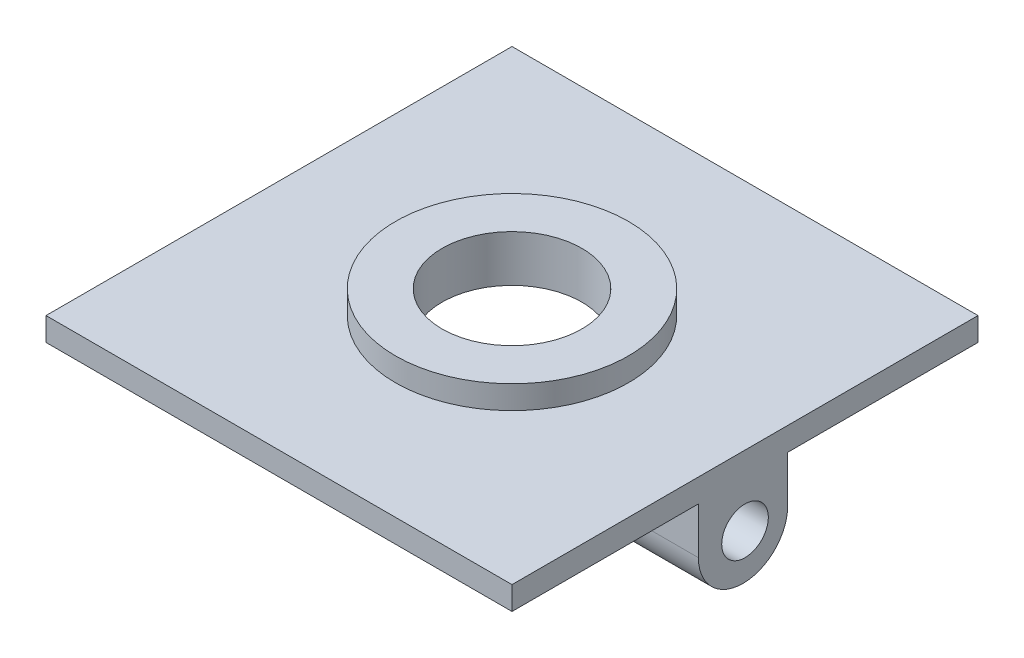
ISO-10303-21;
HEADER;
FILE_DESCRIPTION(('STEP AP214'),'2;1');
FILE_NAME('part.step','',(''),(''),'','','');
FILE_SCHEMA(('AUTOMOTIVE_DESIGN { 1 0 10303 214 1 1 1 1 }'));
ENDSEC;
DATA;
#1=APPLICATION_CONTEXT('core data for automotive mechanical design processes');
#2=APPLICATION_PROTOCOL_DEFINITION('international standard','automotive_design',2000,#1);
#3=PRODUCT_CONTEXT('',#1,'mechanical');
#4=PRODUCT('Part','Part','',(#3));
#5=PRODUCT_RELATED_PRODUCT_CATEGORY('part','',(#4));
#6=PRODUCT_DEFINITION_FORMATION('','',#4);
#7=PRODUCT_DEFINITION_CONTEXT('part definition',#1,'design');
#8=PRODUCT_DEFINITION('design','',#6,#7);
#9=PRODUCT_DEFINITION_SHAPE('','',#8);
#10=(LENGTH_UNIT() NAMED_UNIT(*) SI_UNIT(.MILLI.,.METRE.));
#11=(NAMED_UNIT(*) PLANE_ANGLE_UNIT() SI_UNIT($,.RADIAN.));
#12=(NAMED_UNIT(*) SI_UNIT($,.STERADIAN.) SOLID_ANGLE_UNIT());
#13=UNCERTAINTY_MEASURE_WITH_UNIT(LENGTH_MEASURE(1.E-05),#10,'distance_accuracy_value','');
#14=(GEOMETRIC_REPRESENTATION_CONTEXT(3) GLOBAL_UNCERTAINTY_ASSIGNED_CONTEXT((#13)) GLOBAL_UNIT_ASSIGNED_CONTEXT((#10,
#11,#12)) REPRESENTATION_CONTEXT('',''));
#15=CARTESIAN_POINT('',(0.,0.,0.));
#16=DIRECTION('',(0.,0.,1.));
#17=DIRECTION('',(1.,0.,0.));
#18=AXIS2_PLACEMENT_3D('',#15,#16,#17);
#19=CARTESIAN_POINT('',(0.,0.,0.));
#20=DIRECTION('',(0.,1.,0.));
#21=DIRECTION('',(0.,0.,1.));
#22=AXIS2_PLACEMENT_3D('',#19,#20,#21);
#23=PLANE('',#22);
#24=CARTESIAN_POINT('',(50.,0.,50.));
#25=DIRECTION('',(0.,1.,0.));
#26=DIRECTION('',(0.,0.,1.));
#27=AXIS2_PLACEMENT_3D('',#24,#25,#26);
#28=CIRCLE('',#27,15.);
#29=CARTESIAN_POINT('',(50.,0.,65.));
#30=VERTEX_POINT('',#29);
#31=EDGE_CURVE('E205',#30,#30,#28,.T.);
#32=ORIENTED_EDGE('',*,*,#31,.T.);
#33=EDGE_LOOP('',(#32));
#34=FACE_BOUND('',#33,.T.);
#35=DIRECTION('',(0.,0.,-1.));
#36=VECTOR('',#35,1.);
#37=CARTESIAN_POINT('',(20.,0.,40.));
#38=LINE('',#37,#36);
#39=CARTESIAN_POINT('',(20.,0.,60.));
#40=VERTEX_POINT('',#39);
#41=CARTESIAN_POINT('',(20.,0.,40.));
#42=VERTEX_POINT('',#41);
#43=EDGE_CURVE('E149',#40,#42,#38,.T.);
#44=ORIENTED_EDGE('',*,*,#43,.T.);
#45=DIRECTION('',(-1.,0.,0.));
#46=VECTOR('',#45,1.);
#47=CARTESIAN_POINT('',(20.,0.,40.));
#48=LINE('',#47,#46);
#49=CARTESIAN_POINT('',(0.,0.,40.));
#50=VERTEX_POINT('',#49);
#51=EDGE_CURVE('E162',#42,#50,#48,.T.);
#52=ORIENTED_EDGE('',*,*,#51,.T.);
#53=DIRECTION('',(0.,0.,1.));
#54=VECTOR('',#53,1.);
#55=CARTESIAN_POINT('',(0.,0.,0.));
#56=LINE('',#55,#54);
#57=CARTESIAN_POINT('',(0.,0.,0.));
#58=VERTEX_POINT('',#57);
#59=EDGE_CURVE('E225',#58,#50,#56,.T.);
#60=ORIENTED_EDGE('',*,*,#59,.F.);
#61=DIRECTION('',(-1.,0.,0.));
#62=VECTOR('',#61,1.);
#63=CARTESIAN_POINT('',(0.,0.,0.));
#64=LINE('',#63,#62);
#65=CARTESIAN_POINT('',(100.,0.,0.));
#66=VERTEX_POINT('',#65);
#67=EDGE_CURVE('E218',#66,#58,#64,.T.);
#68=ORIENTED_EDGE('',*,*,#67,.F.);
#69=DIRECTION('',(0.,0.,-1.));
#70=VECTOR('',#69,1.);
#71=CARTESIAN_POINT('',(100.,0.,0.));
#72=LINE('',#71,#70);
#73=CARTESIAN_POINT('',(100.,0.,40.8515105993032));
#74=VERTEX_POINT('',#73);
#75=EDGE_CURVE('E230',#74,#66,#72,.T.);
#76=ORIENTED_EDGE('',*,*,#75,.F.);
#77=DIRECTION('',(1.,0.,0.));
#78=VECTOR('',#77,1.);
#79=CARTESIAN_POINT('',(80.,0.,40.8515105993032));
#80=LINE('',#79,#78);
#81=CARTESIAN_POINT('',(80.,0.,40.8515105993032));
#82=VERTEX_POINT('',#81);
#83=EDGE_CURVE('E200',#82,#74,#80,.T.);
#84=ORIENTED_EDGE('',*,*,#83,.F.);
#85=DIRECTION('',(0.,0.,1.));
#86=VECTOR('',#85,1.);
#87=CARTESIAN_POINT('',(80.,0.,60.));
#88=LINE('',#87,#86);
#89=CARTESIAN_POINT('',(80.,0.,60.));
#90=VERTEX_POINT('',#89);
#91=EDGE_CURVE('E187',#82,#90,#88,.T.);
#92=ORIENTED_EDGE('',*,*,#91,.T.);
#93=DIRECTION('',(1.,0.,0.));
#94=VECTOR('',#93,1.);
#95=CARTESIAN_POINT('',(80.,0.,60.));
#96=LINE('',#95,#94);
#97=CARTESIAN_POINT('',(100.,0.,60.));
#98=VERTEX_POINT('',#97);
#99=EDGE_CURVE('E197',#90,#98,#96,.T.);
#100=ORIENTED_EDGE('',*,*,#99,.T.);
#101=CARTESIAN_POINT('',(100.,0.,100.));
#102=VERTEX_POINT('',#101);
#103=EDGE_CURVE('E231',#102,#98,#72,.T.);
#104=ORIENTED_EDGE('',*,*,#103,.F.);
#105=DIRECTION('',(1.,0.,0.));
#106=VECTOR('',#105,1.);
#107=CARTESIAN_POINT('',(0.,0.,100.));
#108=LINE('',#107,#106);
#109=CARTESIAN_POINT('',(0.,0.,100.));
#110=VERTEX_POINT('',#109);
#111=EDGE_CURVE('E228',#110,#102,#108,.T.);
#112=ORIENTED_EDGE('',*,*,#111,.F.);
#113=CARTESIAN_POINT('',(0.,0.,60.));
#114=VERTEX_POINT('',#113);
#115=EDGE_CURVE('E212',#114,#110,#56,.T.);
#116=ORIENTED_EDGE('',*,*,#115,.F.);
#117=DIRECTION('',(-1.,0.,0.));
#118=VECTOR('',#117,1.);
#119=CARTESIAN_POINT('',(20.,0.,60.));
#120=LINE('',#119,#118);
#121=EDGE_CURVE('E175',#40,#114,#120,.T.);
#122=ORIENTED_EDGE('',*,*,#121,.F.);
#123=EDGE_LOOP('',(#44,#52,#60,#68,#76,#84,#92,#100,#104,#112,#116,#122));
#124=FACE_BOUND('',#123,.T.);
#125=ADVANCED_FACE('F48',(#34,#124),#23,.F.);
#126=CARTESIAN_POINT('',(0.,5.,0.));
#127=DIRECTION('',(1.,0.,0.));
#128=DIRECTION('',(0.,0.,-1.));
#129=AXIS2_PLACEMENT_3D('',#126,#127,#128);
#130=PLANE('',#129);
#131=CARTESIAN_POINT('',(0.,-10.,50.));
#132=DIRECTION('',(-1.,0.,0.));
#133=DIRECTION('',(0.,0.,1.));
#134=AXIS2_PLACEMENT_3D('',#131,#132,#133);
#135=CIRCLE('',#134,5.);
#136=CARTESIAN_POINT('',(0.,-10.,55.));
#137=VERTEX_POINT('',#136);
#138=EDGE_CURVE('E453',#137,#137,#135,.T.);
#139=ORIENTED_EDGE('',*,*,#138,.F.);
#140=EDGE_LOOP('',(#139));
#141=FACE_BOUND('',#140,.T.);
#142=ORIENTED_EDGE('',*,*,#59,.T.);
#143=DIRECTION('',(0.,-1.,0.));
#144=VECTOR('',#143,1.);
#145=CARTESIAN_POINT('',(0.,0.,40.));
#146=LINE('',#145,#144);
#147=CARTESIAN_POINT('',(0.,-10.,40.));
#148=VERTEX_POINT('',#147);
#149=EDGE_CURVE('E171',#50,#148,#146,.T.);
#150=ORIENTED_EDGE('',*,*,#149,.T.);
#151=CARTESIAN_POINT('',(0.,-10.,50.));
#152=DIRECTION('',(-1.,0.,0.));
#153=DIRECTION('',(0.,0.,1.));
#154=AXIS2_PLACEMENT_3D('',#151,#152,#153);
#155=CIRCLE('',#154,10.);
#156=CARTESIAN_POINT('',(0.,-10.,60.));
#157=VERTEX_POINT('',#156);
#158=EDGE_CURVE('E144',#148,#157,#155,.T.);
#159=ORIENTED_EDGE('',*,*,#158,.T.);
#160=DIRECTION('',(0.,1.,0.));
#161=VECTOR('',#160,1.);
#162=CARTESIAN_POINT('',(0.,0.,60.));
#163=LINE('',#162,#161);
#164=EDGE_CURVE('E65',#157,#114,#163,.T.);
#165=ORIENTED_EDGE('',*,*,#164,.T.);
#166=ORIENTED_EDGE('',*,*,#115,.T.);
#167=DIRECTION('',(0.,-1.,0.));
#168=VECTOR('',#167,1.);
#169=CARTESIAN_POINT('',(0.,5.,100.));
#170=LINE('',#169,#168);
#171=CARTESIAN_POINT('',(0.,5.,100.));
#172=VERTEX_POINT('',#171);
#173=EDGE_CURVE('E57',#172,#110,#170,.T.);
#174=ORIENTED_EDGE('',*,*,#173,.F.);
#175=DIRECTION('',(0.,0.,1.));
#176=VECTOR('',#175,1.);
#177=CARTESIAN_POINT('',(0.,5.,0.));
#178=LINE('',#177,#176);
#179=CARTESIAN_POINT('',(0.,5.,0.));
#180=VERTEX_POINT('',#179);
#181=EDGE_CURVE('E214',#180,#172,#178,.T.);
#182=ORIENTED_EDGE('',*,*,#181,.F.);
#183=DIRECTION('',(0.,-1.,0.));
#184=VECTOR('',#183,1.);
#185=CARTESIAN_POINT('',(0.,5.,0.));
#186=LINE('',#185,#184);
#187=EDGE_CURVE('E224',#180,#58,#186,.T.);
#188=ORIENTED_EDGE('',*,*,#187,.T.);
#189=EDGE_LOOP('',(#142,#150,#159,#165,#166,#174,#182,#188));
#190=FACE_BOUND('',#189,.T.);
#191=ADVANCED_FACE('F50',(#141,#190),#130,.F.);
#192=CARTESIAN_POINT('',(0.,5.,100.));
#193=DIRECTION('',(0.,0.,-1.));
#194=DIRECTION('',(-1.,0.,0.));
#195=AXIS2_PLACEMENT_3D('',#192,#193,#194);
#196=PLANE('',#195);
#197=ORIENTED_EDGE('',*,*,#111,.T.);
#198=DIRECTION('',(0.,-1.,0.));
#199=VECTOR('',#198,1.);
#200=CARTESIAN_POINT('',(100.,5.,100.));
#201=LINE('',#200,#199);
#202=CARTESIAN_POINT('',(100.,5.,100.));
#203=VERTEX_POINT('',#202);
#204=EDGE_CURVE('E240',#203,#102,#201,.T.);
#205=ORIENTED_EDGE('',*,*,#204,.F.);
#206=DIRECTION('',(1.,0.,0.));
#207=VECTOR('',#206,1.);
#208=CARTESIAN_POINT('',(0.,5.,100.));
#209=LINE('',#208,#207);
#210=EDGE_CURVE('E217',#172,#203,#209,.T.);
#211=ORIENTED_EDGE('',*,*,#210,.F.);
#212=ORIENTED_EDGE('',*,*,#173,.T.);
#213=EDGE_LOOP('',(#197,#205,#211,#212));
#214=FACE_BOUND('',#213,.T.);
#215=ADVANCED_FACE('F245',(#214),#196,.F.);
#216=CARTESIAN_POINT('',(100.,5.,0.));
#217=DIRECTION('',(-1.,0.,0.));
#218=DIRECTION('',(0.,0.,1.));
#219=AXIS2_PLACEMENT_3D('',#216,#217,#218);
#220=PLANE('',#219);
#221=CARTESIAN_POINT('',(100.,-10.,50.));
#222=DIRECTION('',(-1.,0.,0.));
#223=DIRECTION('',(0.,0.,1.));
#224=AXIS2_PLACEMENT_3D('',#221,#222,#223);
#225=CIRCLE('',#224,5.);
#226=CARTESIAN_POINT('',(100.,-10.,55.));
#227=VERTEX_POINT('',#226);
#228=EDGE_CURVE('E448',#227,#227,#225,.T.);
#229=ORIENTED_EDGE('',*,*,#228,.T.);
#230=EDGE_LOOP('',(#229));
#231=FACE_BOUND('',#230,.T.);
#232=ORIENTED_EDGE('',*,*,#103,.T.);
#233=DIRECTION('',(0.,-1.,0.));
#234=VECTOR('',#233,1.);
#235=CARTESIAN_POINT('',(100.,0.,60.));
#236=LINE('',#235,#234);
#237=CARTESIAN_POINT('',(100.,-10.,60.));
#238=VERTEX_POINT('',#237);
#239=EDGE_CURVE('E73',#98,#238,#236,.T.);
#240=ORIENTED_EDGE('',*,*,#239,.T.);
#241=CARTESIAN_POINT('',(100.,-10.,50.4257552996516));
#242=DIRECTION('',(1.,0.,0.));
#243=DIRECTION('',(0.,0.,-1.));
#244=AXIS2_PLACEMENT_3D('',#241,#242,#243);
#245=CIRCLE('',#244,9.57424470034838);
#246=CARTESIAN_POINT('',(100.,-10.,40.8515105993032));
#247=VERTEX_POINT('',#246);
#248=EDGE_CURVE('E192',#238,#247,#245,.T.);
#249=ORIENTED_EDGE('',*,*,#248,.T.);
#250=DIRECTION('',(0.,1.,0.));
#251=VECTOR('',#250,1.);
#252=CARTESIAN_POINT('',(100.,0.,40.8515105993032));
#253=LINE('',#252,#251);
#254=EDGE_CURVE('E182',#247,#74,#253,.T.);
#255=ORIENTED_EDGE('',*,*,#254,.T.);
#256=ORIENTED_EDGE('',*,*,#75,.T.);
#257=DIRECTION('',(0.,-1.,0.));
#258=VECTOR('',#257,1.);
#259=CARTESIAN_POINT('',(100.,5.,0.));
#260=LINE('',#259,#258);
#261=CARTESIAN_POINT('',(100.,5.,0.));
#262=VERTEX_POINT('',#261);
#263=EDGE_CURVE('E237',#262,#66,#260,.T.);
#264=ORIENTED_EDGE('',*,*,#263,.F.);
#265=DIRECTION('',(0.,0.,-1.));
#266=VECTOR('',#265,1.);
#267=CARTESIAN_POINT('',(100.,5.,0.));
#268=LINE('',#267,#266);
#269=EDGE_CURVE('E220',#203,#262,#268,.T.);
#270=ORIENTED_EDGE('',*,*,#269,.F.);
#271=ORIENTED_EDGE('',*,*,#204,.T.);
#272=EDGE_LOOP('',(#232,#240,#249,#255,#256,#264,#270,#271));
#273=FACE_BOUND('',#272,.T.);
#274=ADVANCED_FACE('F254',(#231,#273),#220,.F.);
#275=CARTESIAN_POINT('',(0.,5.,0.));
#276=DIRECTION('',(0.,0.,1.));
#277=DIRECTION('',(1.,0.,0.));
#278=AXIS2_PLACEMENT_3D('',#275,#276,#277);
#279=PLANE('',#278);
#280=ORIENTED_EDGE('',*,*,#67,.T.);
#281=ORIENTED_EDGE('',*,*,#187,.F.);
#282=DIRECTION('',(-1.,0.,0.));
#283=VECTOR('',#282,1.);
#284=CARTESIAN_POINT('',(0.,5.,0.));
#285=LINE('',#284,#283);
#286=EDGE_CURVE('E222',#262,#180,#285,.T.);
#287=ORIENTED_EDGE('',*,*,#286,.F.);
#288=ORIENTED_EDGE('',*,*,#263,.T.);
#289=EDGE_LOOP('',(#280,#281,#287,#288));
#290=FACE_BOUND('',#289,.T.);
#291=ADVANCED_FACE('F262',(#290),#279,.F.);
#292=CARTESIAN_POINT('',(0.,5.,0.));
#293=DIRECTION('',(0.,1.,0.));
#294=DIRECTION('',(0.,0.,1.));
#295=AXIS2_PLACEMENT_3D('',#292,#293,#294);
#296=PLANE('',#295);
#297=CARTESIAN_POINT('',(50.,5.,50.));
#298=DIRECTION('',(0.,1.,0.));
#299=DIRECTION('',(0.,0.,1.));
#300=AXIS2_PLACEMENT_3D('',#297,#298,#299);
#301=CIRCLE('',#300,25.);
#302=CARTESIAN_POINT('',(50.,5.,75.));
#303=VERTEX_POINT('',#302);
#304=EDGE_CURVE('E13',#303,#303,#301,.T.);
#305=ORIENTED_EDGE('',*,*,#304,.F.);
#306=EDGE_LOOP('',(#305));
#307=FACE_BOUND('',#306,.T.);
#308=ORIENTED_EDGE('',*,*,#181,.T.);
#309=ORIENTED_EDGE('',*,*,#210,.T.);
#310=ORIENTED_EDGE('',*,*,#269,.T.);
#311=ORIENTED_EDGE('',*,*,#286,.T.);
#312=EDGE_LOOP('',(#308,#309,#310,#311));
#313=FACE_BOUND('',#312,.T.);
#314=ADVANCED_FACE('F259',(#307,#313),#296,.T.);
#315=CARTESIAN_POINT('',(50.,10.,50.));
#316=DIRECTION('',(0.,-1.,0.));
#317=DIRECTION('',(0.,0.,-1.));
#318=AXIS2_PLACEMENT_3D('',#315,#316,#317);
#319=CYLINDRICAL_SURFACE('',#318,25.);
#320=CARTESIAN_POINT('',(50.,10.,50.));
#321=DIRECTION('',(0.,1.,0.));
#322=DIRECTION('',(0.,0.,1.));
#323=AXIS2_PLACEMENT_3D('',#320,#321,#322);
#324=CIRCLE('',#323,25.);
#325=CARTESIAN_POINT('',(50.,10.,75.));
#326=VERTEX_POINT('',#325);
#327=EDGE_CURVE('E208',#326,#326,#324,.T.);
#328=ORIENTED_EDGE('',*,*,#327,.F.);
#329=EDGE_LOOP('',(#328));
#330=FACE_BOUND('',#329,.T.);
#331=ORIENTED_EDGE('',*,*,#304,.T.);
#332=EDGE_LOOP('',(#331));
#333=FACE_BOUND('',#332,.T.);
#334=ADVANCED_FACE('F312',(#330,#333),#319,.T.);
#335=CARTESIAN_POINT('',(50.,10.,50.));
#336=DIRECTION('',(0.,1.,0.));
#337=DIRECTION('',(0.,0.,1.));
#338=AXIS2_PLACEMENT_3D('',#335,#336,#337);
#339=PLANE('',#338);
#340=CARTESIAN_POINT('',(50.,10.,50.));
#341=DIRECTION('',(0.,1.,0.));
#342=DIRECTION('',(0.,0.,1.));
#343=AXIS2_PLACEMENT_3D('',#340,#341,#342);
#344=CIRCLE('',#343,15.);
#345=CARTESIAN_POINT('',(50.,10.,65.));
#346=VERTEX_POINT('',#345);
#347=EDGE_CURVE('E199',#346,#346,#344,.T.);
#348=ORIENTED_EDGE('',*,*,#347,.F.);
#349=EDGE_LOOP('',(#348));
#350=FACE_BOUND('',#349,.T.);
#351=ORIENTED_EDGE('',*,*,#327,.T.);
#352=EDGE_LOOP('',(#351));
#353=FACE_BOUND('',#352,.T.);
#354=ADVANCED_FACE('F319',(#350,#353),#339,.T.);
#355=CARTESIAN_POINT('',(50.,0.,50.));
#356=DIRECTION('',(0.,1.,0.));
#357=DIRECTION('',(0.,0.,1.));
#358=AXIS2_PLACEMENT_3D('',#355,#356,#357);
#359=CYLINDRICAL_SURFACE('',#358,15.);
#360=ORIENTED_EDGE('',*,*,#31,.F.);
#361=EDGE_LOOP('',(#360));
#362=FACE_BOUND('',#361,.T.);
#363=ORIENTED_EDGE('',*,*,#347,.T.);
#364=EDGE_LOOP('',(#363));
#365=FACE_BOUND('',#364,.T.);
#366=ADVANCED_FACE('F326',(#362,#365),#359,.F.);
#367=CARTESIAN_POINT('',(80.,0.,60.));
#368=DIRECTION('',(0.,0.,1.));
#369=DIRECTION('',(1.,0.,0.));
#370=AXIS2_PLACEMENT_3D('',#367,#368,#369);
#371=PLANE('',#370);
#372=ORIENTED_EDGE('',*,*,#239,.F.);
#373=ORIENTED_EDGE('',*,*,#99,.F.);
#374=DIRECTION('',(0.,-1.,0.));
#375=VECTOR('',#374,1.);
#376=CARTESIAN_POINT('',(80.,0.,60.));
#377=LINE('',#376,#375);
#378=CARTESIAN_POINT('',(80.,-10.,60.));
#379=VERTEX_POINT('',#378);
#380=EDGE_CURVE('E178',#90,#379,#377,.T.);
#381=ORIENTED_EDGE('',*,*,#380,.T.);
#382=DIRECTION('',(1.,0.,0.));
#383=VECTOR('',#382,1.);
#384=CARTESIAN_POINT('',(80.,-10.,60.));
#385=LINE('',#384,#383);
#386=EDGE_CURVE('E190',#379,#238,#385,.T.);
#387=ORIENTED_EDGE('',*,*,#386,.T.);
#388=EDGE_LOOP('',(#372,#373,#381,#387));
#389=FACE_BOUND('',#388,.T.);
#390=ADVANCED_FACE('F334',(#389),#371,.T.);
#391=CARTESIAN_POINT('',(80.,0.,40.8515105993032));
#392=DIRECTION('',(0.,0.,-1.));
#393=DIRECTION('',(-1.,0.,0.));
#394=AXIS2_PLACEMENT_3D('',#391,#392,#393);
#395=PLANE('',#394);
#396=ORIENTED_EDGE('',*,*,#254,.F.);
#397=DIRECTION('',(1.,0.,0.));
#398=VECTOR('',#397,1.);
#399=CARTESIAN_POINT('',(80.,-10.,40.8515105993032));
#400=LINE('',#399,#398);
#401=CARTESIAN_POINT('',(80.,-10.,40.8515105993032));
#402=VERTEX_POINT('',#401);
#403=EDGE_CURVE('E202',#402,#247,#400,.T.);
#404=ORIENTED_EDGE('',*,*,#403,.F.);
#405=DIRECTION('',(0.,1.,0.));
#406=VECTOR('',#405,1.);
#407=CARTESIAN_POINT('',(80.,0.,40.8515105993032));
#408=LINE('',#407,#406);
#409=EDGE_CURVE('E185',#402,#82,#408,.T.);
#410=ORIENTED_EDGE('',*,*,#409,.T.);
#411=ORIENTED_EDGE('',*,*,#83,.T.);
#412=EDGE_LOOP('',(#396,#404,#410,#411));
#413=FACE_BOUND('',#412,.T.);
#414=ADVANCED_FACE('F342',(#413),#395,.T.);
#415=CARTESIAN_POINT('',(80.,-10.,50.4257552996516));
#416=DIRECTION('',(1.,0.,0.));
#417=DIRECTION('',(0.,0.,-1.));
#418=AXIS2_PLACEMENT_3D('',#415,#416,#417);
#419=CYLINDRICAL_SURFACE('',#418,9.57424470034838);
#420=ORIENTED_EDGE('',*,*,#248,.F.);
#421=ORIENTED_EDGE('',*,*,#386,.F.);
#422=CARTESIAN_POINT('',(80.,-10.,50.4257552996516));
#423=DIRECTION('',(1.,0.,0.));
#424=DIRECTION('',(0.,0.,-1.));
#425=AXIS2_PLACEMENT_3D('',#422,#423,#424);
#426=CIRCLE('',#425,9.57424470034838);
#427=EDGE_CURVE('E181',#379,#402,#426,.T.);
#428=ORIENTED_EDGE('',*,*,#427,.T.);
#429=ORIENTED_EDGE('',*,*,#403,.T.);
#430=EDGE_LOOP('',(#420,#421,#428,#429));
#431=FACE_BOUND('',#430,.T.);
#432=ADVANCED_FACE('F349',(#431),#419,.T.);
#433=CARTESIAN_POINT('',(80.,-10.,50.4257552996516));
#434=DIRECTION('',(1.,0.,0.));
#435=DIRECTION('',(0.,0.,-1.));
#436=AXIS2_PLACEMENT_3D('',#433,#434,#435);
#437=PLANE('',#436);
#438=CARTESIAN_POINT('',(80.,-10.,50.));
#439=DIRECTION('',(1.,0.,0.));
#440=DIRECTION('',(0.,0.,-1.));
#441=AXIS2_PLACEMENT_3D('',#438,#439,#440);
#442=CIRCLE('',#441,5.);
#443=CARTESIAN_POINT('',(80.,-10.,55.));
#444=VERTEX_POINT('',#443);
#445=EDGE_CURVE('E166',#444,#444,#442,.T.);
#446=ORIENTED_EDGE('',*,*,#445,.T.);
#447=EDGE_LOOP('',(#446));
#448=FACE_BOUND('',#447,.T.);
#449=ORIENTED_EDGE('',*,*,#380,.F.);
#450=ORIENTED_EDGE('',*,*,#91,.F.);
#451=ORIENTED_EDGE('',*,*,#409,.F.);
#452=ORIENTED_EDGE('',*,*,#427,.F.);
#453=EDGE_LOOP('',(#449,#450,#451,#452));
#454=FACE_BOUND('',#453,.T.);
#455=ADVANCED_FACE('F275',(#448,#454),#437,.F.);
#456=CARTESIAN_POINT('',(20.,0.,40.));
#457=DIRECTION('',(0.,0.,-1.));
#458=DIRECTION('',(-1.,0.,0.));
#459=AXIS2_PLACEMENT_3D('',#456,#457,#458);
#460=PLANE('',#459);
#461=ORIENTED_EDGE('',*,*,#149,.F.);
#462=ORIENTED_EDGE('',*,*,#51,.F.);
#463=DIRECTION('',(0.,-1.,0.));
#464=VECTOR('',#463,1.);
#465=CARTESIAN_POINT('',(20.,0.,40.));
#466=LINE('',#465,#464);
#467=CARTESIAN_POINT('',(20.,-10.,40.));
#468=VERTEX_POINT('',#467);
#469=EDGE_CURVE('E156',#42,#468,#466,.T.);
#470=ORIENTED_EDGE('',*,*,#469,.T.);
#471=DIRECTION('',(-1.,0.,0.));
#472=VECTOR('',#471,1.);
#473=CARTESIAN_POINT('',(20.,-10.,40.));
#474=LINE('',#473,#472);
#475=EDGE_CURVE('E140',#468,#148,#474,.T.);
#476=ORIENTED_EDGE('',*,*,#475,.T.);
#477=EDGE_LOOP('',(#461,#462,#470,#476));
#478=FACE_BOUND('',#477,.T.);
#479=ADVANCED_FACE('F160',(#478),#460,.T.);
#480=CARTESIAN_POINT('',(20.,0.,60.));
#481=DIRECTION('',(0.,0.,1.));
#482=DIRECTION('',(1.,0.,0.));
#483=AXIS2_PLACEMENT_3D('',#480,#481,#482);
#484=PLANE('',#483);
#485=ORIENTED_EDGE('',*,*,#164,.F.);
#486=DIRECTION('',(-1.,0.,0.));
#487=VECTOR('',#486,1.);
#488=CARTESIAN_POINT('',(20.,-10.,60.));
#489=LINE('',#488,#487);
#490=CARTESIAN_POINT('',(20.,-10.,60.));
#491=VERTEX_POINT('',#490);
#492=EDGE_CURVE('E148',#491,#157,#489,.T.);
#493=ORIENTED_EDGE('',*,*,#492,.F.);
#494=DIRECTION('',(0.,1.,0.));
#495=VECTOR('',#494,1.);
#496=CARTESIAN_POINT('',(20.,0.,60.));
#497=LINE('',#496,#495);
#498=EDGE_CURVE('E158',#491,#40,#497,.T.);
#499=ORIENTED_EDGE('',*,*,#498,.T.);
#500=ORIENTED_EDGE('',*,*,#121,.T.);
#501=EDGE_LOOP('',(#485,#493,#499,#500));
#502=FACE_BOUND('',#501,.T.);
#503=ADVANCED_FACE('F267',(#502),#484,.T.);
#504=CARTESIAN_POINT('',(20.,-10.,50.));
#505=DIRECTION('',(-1.,0.,0.));
#506=DIRECTION('',(0.,0.,1.));
#507=AXIS2_PLACEMENT_3D('',#504,#505,#506);
#508=CYLINDRICAL_SURFACE('',#507,10.);
#509=ORIENTED_EDGE('',*,*,#158,.F.);
#510=ORIENTED_EDGE('',*,*,#475,.F.);
#511=CARTESIAN_POINT('',(20.,-10.,50.));
#512=DIRECTION('',(-1.,0.,0.));
#513=DIRECTION('',(0.,0.,1.));
#514=AXIS2_PLACEMENT_3D('',#511,#512,#513);
#515=CIRCLE('',#514,10.);
#516=EDGE_CURVE('E143',#468,#491,#515,.T.);
#517=ORIENTED_EDGE('',*,*,#516,.T.);
#518=ORIENTED_EDGE('',*,*,#492,.T.);
#519=EDGE_LOOP('',(#509,#510,#517,#518));
#520=FACE_BOUND('',#519,.T.);
#521=ADVANCED_FACE('F142',(#520),#508,.T.);
#522=CARTESIAN_POINT('',(20.,-10.,50.));
#523=DIRECTION('',(-1.,0.,0.));
#524=DIRECTION('',(0.,0.,1.));
#525=AXIS2_PLACEMENT_3D('',#522,#523,#524);
#526=PLANE('',#525);
#527=CARTESIAN_POINT('',(20.,-10.,50.));
#528=DIRECTION('',(-1.,0.,0.));
#529=DIRECTION('',(0.,0.,1.));
#530=AXIS2_PLACEMENT_3D('',#527,#528,#529);
#531=CIRCLE('',#530,5.);
#532=CARTESIAN_POINT('',(20.,-10.,55.));
#533=VERTEX_POINT('',#532);
#534=EDGE_CURVE('E52',#533,#533,#531,.T.);
#535=ORIENTED_EDGE('',*,*,#534,.T.);
#536=EDGE_LOOP('',(#535));
#537=FACE_BOUND('',#536,.T.);
#538=ORIENTED_EDGE('',*,*,#469,.F.);
#539=ORIENTED_EDGE('',*,*,#43,.F.);
#540=ORIENTED_EDGE('',*,*,#498,.F.);
#541=ORIENTED_EDGE('',*,*,#516,.F.);
#542=EDGE_LOOP('',(#538,#539,#540,#541));
#543=FACE_BOUND('',#542,.T.);
#544=ADVANCED_FACE('F154',(#537,#543),#526,.F.);
#545=CARTESIAN_POINT('',(100.,-10.,50.));
#546=DIRECTION('',(-1.,0.,0.));
#547=DIRECTION('',(0.,0.,1.));
#548=AXIS2_PLACEMENT_3D('',#545,#546,#547);
#549=CYLINDRICAL_SURFACE('',#548,5.);
#550=CARTESIAN_POINT('',(0.,-10.,55.));
#551=CARTESIAN_POINT('',(0.208333333333334,-10.,55.));
#552=CARTESIAN_POINT('',(0.416666666666667,-10.,55.));
#553=CARTESIAN_POINT('',(0.833333333333334,-10.,55.));
#554=CARTESIAN_POINT('',(1.04166666666667,-10.,55.));
#555=CARTESIAN_POINT('',(1.45833333333333,-10.,55.));
#556=CARTESIAN_POINT('',(1.66666666666667,-10.,55.));
#557=CARTESIAN_POINT('',(2.08333333333334,-10.,55.));
#558=CARTESIAN_POINT('',(2.29166666666667,-10.,55.));
#559=CARTESIAN_POINT('',(2.70833333333334,-10.,55.));
#560=CARTESIAN_POINT('',(2.91666666666667,-10.,55.));
#561=CARTESIAN_POINT('',(3.33333333333334,-10.,55.));
#562=CARTESIAN_POINT('',(3.54166666666667,-10.,55.));
#563=CARTESIAN_POINT('',(3.95833333333334,-10.,55.));
#564=CARTESIAN_POINT('',(4.16666666666667,-10.,55.));
#565=CARTESIAN_POINT('',(4.58333333333334,-10.,55.));
#566=CARTESIAN_POINT('',(4.79166666666667,-10.,55.));
#567=CARTESIAN_POINT('',(5.20833333333334,-10.,55.));
#568=CARTESIAN_POINT('',(5.41666666666667,-10.,55.));
#569=CARTESIAN_POINT('',(5.83333333333334,-10.,55.));
#570=CARTESIAN_POINT('',(6.04166666666667,-10.,55.));
#571=CARTESIAN_POINT('',(6.45833333333334,-10.,55.));
#572=CARTESIAN_POINT('',(6.66666666666667,-10.,55.));
#573=CARTESIAN_POINT('',(7.08333333333334,-10.,55.));
#574=CARTESIAN_POINT('',(7.29166666666667,-10.,55.));
#575=CARTESIAN_POINT('',(7.70833333333334,-10.,55.));
#576=CARTESIAN_POINT('',(7.91666666666667,-10.,55.));
#577=CARTESIAN_POINT('',(8.33333333333334,-10.,55.));
#578=CARTESIAN_POINT('',(8.54166666666667,-10.,55.));
#579=CARTESIAN_POINT('',(8.95833333333334,-10.,55.));
#580=CARTESIAN_POINT('',(9.16666666666667,-10.,55.));
#581=CARTESIAN_POINT('',(9.58333333333334,-10.,55.));
#582=CARTESIAN_POINT('',(9.79166666666668,-10.,55.));
#583=CARTESIAN_POINT('',(10.2083333333333,-10.,55.));
#584=CARTESIAN_POINT('',(10.4166666666667,-10.,55.));
#585=CARTESIAN_POINT('',(10.8333333333333,-10.,55.));
#586=CARTESIAN_POINT('',(11.0416666666667,-10.,55.));
#587=CARTESIAN_POINT('',(11.4583333333333,-10.,55.));
#588=CARTESIAN_POINT('',(11.6666666666667,-10.,55.));
#589=CARTESIAN_POINT('',(12.0833333333333,-10.,55.));
#590=CARTESIAN_POINT('',(12.2916666666667,-10.,55.));
#591=CARTESIAN_POINT('',(12.7083333333333,-10.,55.));
#592=CARTESIAN_POINT('',(12.9166666666667,-10.,55.));
#593=CARTESIAN_POINT('',(13.3333333333333,-10.,55.));
#594=CARTESIAN_POINT('',(13.5416666666667,-10.,55.));
#595=CARTESIAN_POINT('',(13.9583333333333,-10.,55.));
#596=CARTESIAN_POINT('',(14.1666666666667,-10.,55.));
#597=CARTESIAN_POINT('',(14.5833333333333,-10.,55.));
#598=CARTESIAN_POINT('',(14.7916666666667,-10.,55.));
#599=CARTESIAN_POINT('',(15.2083333333333,-10.,55.));
#600=CARTESIAN_POINT('',(15.4166666666667,-10.,55.));
#601=CARTESIAN_POINT('',(15.8333333333333,-10.,55.));
#602=CARTESIAN_POINT('',(16.0416666666667,-10.,55.));
#603=CARTESIAN_POINT('',(16.4583333333333,-10.,55.));
#604=CARTESIAN_POINT('',(16.6666666666667,-10.,55.));
#605=CARTESIAN_POINT('',(17.0833333333333,-10.,55.));
#606=CARTESIAN_POINT('',(17.2916666666667,-10.,55.));
#607=CARTESIAN_POINT('',(17.7083333333333,-10.,55.));
#608=CARTESIAN_POINT('',(17.9166666666667,-10.,55.));
#609=CARTESIAN_POINT('',(18.3333333333333,-10.,55.));
#610=CARTESIAN_POINT('',(18.5416666666667,-10.,55.));
#611=CARTESIAN_POINT('',(18.9583333333333,-10.,55.));
#612=CARTESIAN_POINT('',(19.1666666666667,-10.,55.));
#613=CARTESIAN_POINT('',(19.5833333333334,-10.,55.));
#614=CARTESIAN_POINT('',(19.7916666666667,-10.,55.));
#615=CARTESIAN_POINT('',(20.,-10.,55.));
#616=B_SPLINE_CURVE_WITH_KNOTS('',3,(#550,#551,#552,#553,#554,#555,#556,#557,#558,#559,#560,
#561,#562,#563,#564,#565,#566,#567,#568,#569,#570,#571,#572,#573,#574,#575,#576,#577,#578,#579,
#580,#581,#582,#583,#584,#585,#586,#587,#588,#589,#590,#591,#592,#593,#594,#595,#596,#597,#598,
#599,#600,#601,#602,#603,#604,#605,#606,#607,#608,#609,#610,#611,#612,#613,#614,#615),
.UNSPECIFIED.,.F.,.F.,(4,2,2,2,2,2,2,2,2,2,2,2,2,2,2,2,2,2,2,2,2,2,2,2,2,2,2,2,2,2,2,2,4),(0.,
0.625000000000001,1.25,1.875,2.5,3.125,3.75,4.375,5.,5.62500000000001,6.25000000000001,
6.87500000000001,7.50000000000001,8.12500000000001,8.75000000000001,9.37500000000001,10.,10.625,
11.25,11.875,12.5,13.125,13.75,14.375,15.,15.625,16.25,16.875,17.5,18.125,18.75,19.375,20.),.UNSPECIFIED.);
#617=EDGE_CURVE('BSEAM423',#137,#533,#616,.T.);
#618=ORIENTED_EDGE('',*,*,#138,.T.);
#619=ORIENTED_EDGE('',*,*,#534,.F.);
#620=ORIENTED_EDGE('',*,*,#617,.T.);
#621=ORIENTED_EDGE('',*,*,#617,.F.);
#622=EDGE_LOOP('',(#618,#620,#619,#621));
#623=FACE_BOUND('',#622,.T.);
#624=ADVANCED_FACE('F423',(#623),#549,.F.);
#625=CARTESIAN_POINT('',(100.,-10.,55.));
#626=CARTESIAN_POINT('',(99.7916666666667,-10.,55.));
#627=CARTESIAN_POINT('',(99.5833333333334,-10.,55.));
#628=CARTESIAN_POINT('',(99.1666666666667,-10.,55.));
#629=CARTESIAN_POINT('',(98.9583333333334,-10.,55.));
#630=CARTESIAN_POINT('',(98.5416666666667,-10.,55.));
#631=CARTESIAN_POINT('',(98.3333333333334,-10.,55.));
#632=CARTESIAN_POINT('',(97.9166666666667,-10.,55.));
#633=CARTESIAN_POINT('',(97.7083333333334,-10.,55.));
#634=CARTESIAN_POINT('',(97.2916666666667,-10.,55.));
#635=CARTESIAN_POINT('',(97.0833333333334,-10.,55.));
#636=CARTESIAN_POINT('',(96.6666666666667,-10.,55.));
#637=CARTESIAN_POINT('',(96.4583333333334,-10.,55.));
#638=CARTESIAN_POINT('',(96.0416666666667,-10.,55.));
#639=CARTESIAN_POINT('',(95.8333333333334,-10.,55.));
#640=CARTESIAN_POINT('',(95.4166666666667,-10.,55.));
#641=CARTESIAN_POINT('',(95.2083333333334,-10.,55.));
#642=CARTESIAN_POINT('',(94.7916666666667,-10.,55.));
#643=CARTESIAN_POINT('',(94.5833333333334,-10.,55.));
#644=CARTESIAN_POINT('',(94.1666666666667,-10.,55.));
#645=CARTESIAN_POINT('',(93.9583333333334,-10.,55.));
#646=CARTESIAN_POINT('',(93.5416666666667,-10.,55.));
#647=CARTESIAN_POINT('',(93.3333333333334,-10.,55.));
#648=CARTESIAN_POINT('',(92.9166666666667,-10.,55.));
#649=CARTESIAN_POINT('',(92.7083333333334,-10.,55.));
#650=CARTESIAN_POINT('',(92.2916666666667,-10.,55.));
#651=CARTESIAN_POINT('',(92.0833333333334,-10.,55.));
#652=CARTESIAN_POINT('',(91.6666666666667,-10.,55.));
#653=CARTESIAN_POINT('',(91.4583333333334,-10.,55.));
#654=CARTESIAN_POINT('',(91.0416666666667,-10.,55.));
#655=CARTESIAN_POINT('',(90.8333333333334,-10.,55.));
#656=CARTESIAN_POINT('',(90.4166666666667,-10.,55.));
#657=CARTESIAN_POINT('',(90.2083333333334,-10.,55.));
#658=CARTESIAN_POINT('',(89.7916666666667,-10.,55.));
#659=CARTESIAN_POINT('',(89.5833333333334,-10.,55.));
#660=CARTESIAN_POINT('',(89.1666666666667,-10.,55.));
#661=CARTESIAN_POINT('',(88.9583333333334,-10.,55.));
#662=CARTESIAN_POINT('',(88.5416666666667,-10.,55.));
#663=CARTESIAN_POINT('',(88.3333333333334,-10.,55.));
#664=CARTESIAN_POINT('',(87.9166666666667,-10.,55.));
#665=CARTESIAN_POINT('',(87.7083333333334,-10.,55.));
#666=CARTESIAN_POINT('',(87.2916666666667,-10.,55.));
#667=CARTESIAN_POINT('',(87.0833333333334,-10.,55.));
#668=CARTESIAN_POINT('',(86.6666666666667,-10.,55.));
#669=CARTESIAN_POINT('',(86.4583333333334,-10.,55.));
#670=CARTESIAN_POINT('',(86.0416666666667,-10.,55.));
#671=CARTESIAN_POINT('',(85.8333333333334,-10.,55.));
#672=CARTESIAN_POINT('',(85.4166666666667,-10.,55.));
#673=CARTESIAN_POINT('',(85.2083333333334,-10.,55.));
#674=CARTESIAN_POINT('',(84.7916666666667,-10.,55.));
#675=CARTESIAN_POINT('',(84.5833333333334,-10.,55.));
#676=CARTESIAN_POINT('',(84.1666666666667,-10.,55.));
#677=CARTESIAN_POINT('',(83.9583333333334,-10.,55.));
#678=CARTESIAN_POINT('',(83.5416666666667,-10.,55.));
#679=CARTESIAN_POINT('',(83.3333333333334,-10.,55.));
#680=CARTESIAN_POINT('',(82.9166666666667,-10.,55.));
#681=CARTESIAN_POINT('',(82.7083333333334,-10.,55.));
#682=CARTESIAN_POINT('',(82.2916666666667,-10.,55.));
#683=CARTESIAN_POINT('',(82.0833333333334,-10.,55.));
#684=CARTESIAN_POINT('',(81.6666666666667,-10.,55.));
#685=CARTESIAN_POINT('',(81.4583333333334,-10.,55.));
#686=CARTESIAN_POINT('',(81.0416666666667,-10.,55.));
#687=CARTESIAN_POINT('',(80.8333333333334,-10.,55.));
#688=CARTESIAN_POINT('',(80.4166666666667,-10.,55.));
#689=CARTESIAN_POINT('',(80.2083333333334,-10.,55.));
#690=CARTESIAN_POINT('',(80.,-10.,55.));
#691=B_SPLINE_CURVE_WITH_KNOTS('',3,(#625,#626,#627,#628,#629,#630,#631,#632,#633,#634,#635,
#636,#637,#638,#639,#640,#641,#642,#643,#644,#645,#646,#647,#648,#649,#650,#651,#652,#653,#654,
#655,#656,#657,#658,#659,#660,#661,#662,#663,#664,#665,#666,#667,#668,#669,#670,#671,#672,#673,
#674,#675,#676,#677,#678,#679,#680,#681,#682,#683,#684,#685,#686,#687,#688,#689,#690),
.UNSPECIFIED.,.F.,.F.,(4,2,2,2,2,2,2,2,2,2,2,2,2,2,2,2,2,2,2,2,2,2,2,2,2,2,2,2,2,2,2,2,4),(0.,
0.625000000000014,1.25000000000002,1.87500000000002,2.50000000000002,3.12500000000002,
3.75000000000002,4.37500000000002,5.00000000000002,5.62500000000002,6.25000000000002,
6.87500000000002,7.50000000000002,8.12500000000002,8.75000000000002,9.37500000000002,10.,10.625,
11.25,11.875,12.5,13.125,13.75,14.375,15.,15.625,16.25,16.875,17.5,18.125,18.75,19.375,20.),.UNSPECIFIED.);
#692=EDGE_CURVE('BSEAM429',#227,#444,#691,.T.);
#693=ORIENTED_EDGE('',*,*,#228,.F.);
#694=ORIENTED_EDGE('',*,*,#445,.F.);
#695=ORIENTED_EDGE('',*,*,#692,.T.);
#696=ORIENTED_EDGE('',*,*,#692,.F.);
#697=EDGE_LOOP('',(#693,#695,#694,#696));
#698=FACE_BOUND('',#697,.T.);
#699=ADVANCED_FACE('F429',(#698),#549,.F.);
#700=CLOSED_SHELL('',(#125,#191,#215,#274,#291,#314,#334,#354,#366,#390,#414,#432,#455,#479,
#503,#521,#544,#624,#699));
#701=MANIFOLD_SOLID_BREP('B2',#700);
#702=ADVANCED_BREP_SHAPE_REPRESENTATION('',(#18,#701),#14);
#703=SHAPE_DEFINITION_REPRESENTATION(#9,#702);
ENDSEC;
END-ISO-10303-21;
